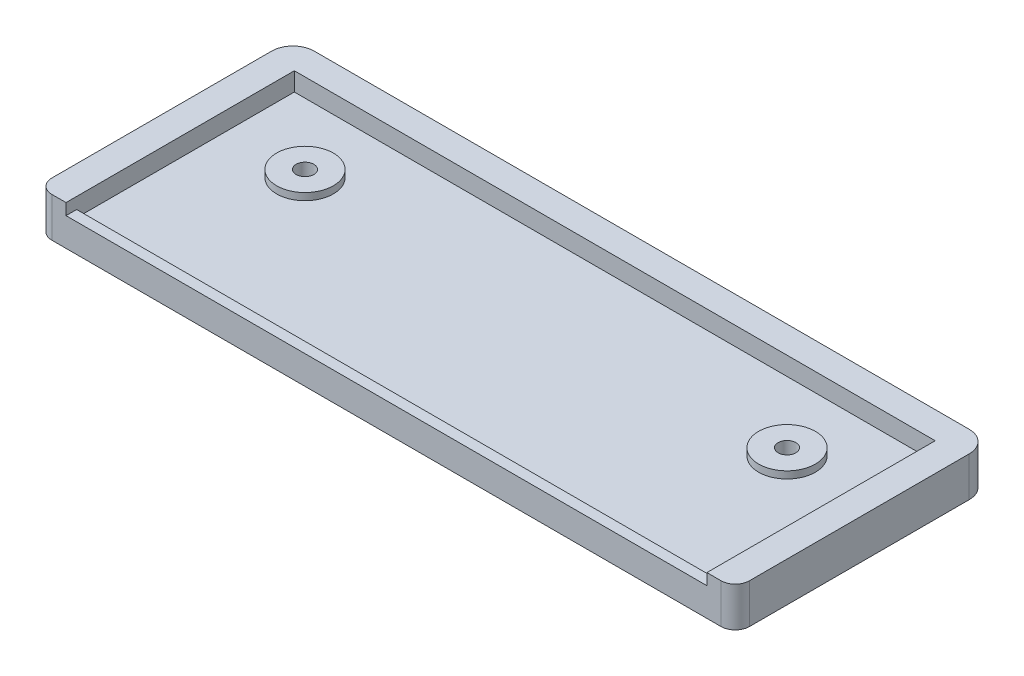
ISO-10303-21;
HEADER;
FILE_DESCRIPTION(('STEP AP214'),'2;1');
FILE_NAME('part.step','',(''),(''),'','','');
FILE_SCHEMA(('AUTOMOTIVE_DESIGN { 1 0 10303 214 1 1 1 1 }'));
ENDSEC;
DATA;
#1=APPLICATION_CONTEXT('core data for automotive mechanical design processes');
#2=APPLICATION_PROTOCOL_DEFINITION('international standard','automotive_design',2000,#1);
#3=PRODUCT_CONTEXT('',#1,'mechanical');
#4=PRODUCT('Part','Part','',(#3));
#5=PRODUCT_RELATED_PRODUCT_CATEGORY('part','',(#4));
#6=PRODUCT_DEFINITION_FORMATION('','',#4);
#7=PRODUCT_DEFINITION_CONTEXT('part definition',#1,'design');
#8=PRODUCT_DEFINITION('design','',#6,#7);
#9=PRODUCT_DEFINITION_SHAPE('','',#8);
#10=(LENGTH_UNIT() NAMED_UNIT(*) SI_UNIT(.MILLI.,.METRE.));
#11=(NAMED_UNIT(*) PLANE_ANGLE_UNIT() SI_UNIT($,.RADIAN.));
#12=(NAMED_UNIT(*) SI_UNIT($,.STERADIAN.) SOLID_ANGLE_UNIT());
#13=UNCERTAINTY_MEASURE_WITH_UNIT(LENGTH_MEASURE(1.E-05),#10,'distance_accuracy_value','');
#14=(GEOMETRIC_REPRESENTATION_CONTEXT(3) GLOBAL_UNCERTAINTY_ASSIGNED_CONTEXT((#13)) GLOBAL_UNIT_ASSIGNED_CONTEXT((#10,
#11,#12)) REPRESENTATION_CONTEXT('',''));
#15=CARTESIAN_POINT('',(0.,0.,0.));
#16=DIRECTION('',(0.,0.,1.));
#17=DIRECTION('',(1.,0.,0.));
#18=AXIS2_PLACEMENT_3D('',#15,#16,#17);
#19=CARTESIAN_POINT('',(0.,3.,0.));
#20=DIRECTION('',(0.,1.,0.));
#21=DIRECTION('',(0.,0.,1.));
#22=AXIS2_PLACEMENT_3D('',#19,#20,#21);
#23=PLANE('',#22);
#24=CARTESIAN_POINT('',(11.,3.,9.5));
#25=DIRECTION('',(0.,1.,0.));
#26=DIRECTION('',(0.,0.,1.));
#27=AXIS2_PLACEMENT_3D('',#24,#25,#26);
#28=CIRCLE('',#27,4.);
#29=CARTESIAN_POINT('',(11.,3.,13.5));
#30=VERTEX_POINT('',#29);
#31=EDGE_CURVE('E350',#30,#30,#28,.T.);
#32=ORIENTED_EDGE('',*,*,#31,.F.);
#33=EDGE_LOOP('',(#32));
#34=FACE_BOUND('',#33,.T.);
#35=CARTESIAN_POINT('',(78.98,3.,9.5));
#36=DIRECTION('',(0.,1.,0.));
#37=DIRECTION('',(0.,0.,1.));
#38=AXIS2_PLACEMENT_3D('',#35,#36,#37);
#39=CIRCLE('',#38,4.00000000000001);
#40=CARTESIAN_POINT('',(78.98,3.,13.5));
#41=VERTEX_POINT('',#40);
#42=EDGE_CURVE('E458',#41,#41,#39,.T.);
#43=ORIENTED_EDGE('',*,*,#42,.F.);
#44=EDGE_LOOP('',(#43));
#45=FACE_BOUND('',#44,.T.);
#46=DIRECTION('',(0.,0.,1.));
#47=VECTOR('',#46,1.);
#48=CARTESIAN_POINT('',(-0.199999999999996,3.,0.));
#49=LINE('',#48,#47);
#50=CARTESIAN_POINT('',(-0.199999999999996,3.,-0.199999999999999));
#51=VERTEX_POINT('',#50);
#52=CARTESIAN_POINT('',(-0.199999999999996,3.,30.5));
#53=VERTEX_POINT('',#52);
#54=EDGE_CURVE('E346',#51,#53,#49,.T.);
#55=ORIENTED_EDGE('',*,*,#54,.T.);
#56=DIRECTION('',(-1.,0.,0.));
#57=VECTOR('',#56,1.);
#58=CARTESIAN_POINT('',(-0.199999999999996,3.,30.5));
#59=LINE('',#58,#57);
#60=CARTESIAN_POINT('',(90.18,3.,30.5));
#61=VERTEX_POINT('',#60);
#62=EDGE_CURVE('E326',#61,#53,#59,.T.);
#63=ORIENTED_EDGE('',*,*,#62,.F.);
#64=DIRECTION('',(0.,0.,-1.));
#65=VECTOR('',#64,1.);
#66=CARTESIAN_POINT('',(90.18,3.,0.));
#67=LINE('',#66,#65);
#68=CARTESIAN_POINT('',(90.18,3.,-0.199999999999999));
#69=VERTEX_POINT('',#68);
#70=EDGE_CURVE('E463',#61,#69,#67,.T.);
#71=ORIENTED_EDGE('',*,*,#70,.T.);
#72=DIRECTION('',(-1.,0.,0.));
#73=VECTOR('',#72,1.);
#74=CARTESIAN_POINT('',(0.,3.,-0.199999999999999));
#75=LINE('',#74,#73);
#76=EDGE_CURVE('E469',#69,#51,#75,.T.);
#77=ORIENTED_EDGE('',*,*,#76,.T.);
#78=EDGE_LOOP('',(#55,#63,#71,#77));
#79=FACE_BOUND('',#78,.T.);
#80=ADVANCED_FACE('F207',(#34,#45,#79),#23,.T.);
#81=CARTESIAN_POINT('',(90.18,4.,0.));
#82=DIRECTION('',(-1.,0.,0.));
#83=DIRECTION('',(0.,0.,1.));
#84=AXIS2_PLACEMENT_3D('',#81,#82,#83);
#85=PLANE('',#84);
#86=ORIENTED_EDGE('',*,*,#70,.F.);
#87=DIRECTION('',(0.,-1.,0.));
#88=VECTOR('',#87,1.);
#89=CARTESIAN_POINT('',(90.18,4.,30.5));
#90=LINE('',#89,#88);
#91=CARTESIAN_POINT('',(90.18,4.,30.5));
#92=VERTEX_POINT('',#91);
#93=EDGE_CURVE('E480',#92,#61,#90,.T.);
#94=ORIENTED_EDGE('',*,*,#93,.F.);
#95=DIRECTION('',(0.,0.,-1.));
#96=VECTOR('',#95,1.);
#97=CARTESIAN_POINT('',(90.18,4.,32.));
#98=LINE('',#97,#96);
#99=CARTESIAN_POINT('',(90.18,4.,32.));
#100=VERTEX_POINT('',#99);
#101=EDGE_CURVE('E318',#100,#92,#98,.T.);
#102=ORIENTED_EDGE('',*,*,#101,.F.);
#103=DIRECTION('',(0.,-1.,0.));
#104=VECTOR('',#103,1.);
#105=CARTESIAN_POINT('',(90.18,4.,32.));
#106=LINE('',#105,#104);
#107=CARTESIAN_POINT('',(90.18,5.6,32.));
#108=VERTEX_POINT('',#107);
#109=EDGE_CURVE('E314',#108,#100,#106,.T.);
#110=ORIENTED_EDGE('',*,*,#109,.F.);
#111=DIRECTION('',(0.,0.,-1.));
#112=VECTOR('',#111,1.);
#113=CARTESIAN_POINT('',(90.18,5.6,30.));
#114=LINE('',#113,#112);
#115=CARTESIAN_POINT('',(90.18,5.6,-0.199999999999999));
#116=VERTEX_POINT('',#115);
#117=EDGE_CURVE('E484',#108,#116,#114,.T.);
#118=ORIENTED_EDGE('',*,*,#117,.T.);
#119=DIRECTION('',(0.,-1.,0.));
#120=VECTOR('',#119,1.);
#121=CARTESIAN_POINT('',(90.18,4.,-0.199999999999999));
#122=LINE('',#121,#120);
#123=EDGE_CURVE('E339',#116,#69,#122,.T.);
#124=ORIENTED_EDGE('',*,*,#123,.T.);
#125=EDGE_LOOP('',(#86,#94,#102,#110,#118,#124));
#126=FACE_BOUND('',#125,.T.);
#127=ADVANCED_FACE('F528',(#126),#85,.T.);
#128=CARTESIAN_POINT('',(-0.199999999999996,4.,0.));
#129=DIRECTION('',(1.,0.,0.));
#130=DIRECTION('',(0.,0.,-1.));
#131=AXIS2_PLACEMENT_3D('',#128,#129,#130);
#132=PLANE('',#131);
#133=DIRECTION('',(0.,0.,1.));
#134=VECTOR('',#133,1.);
#135=CARTESIAN_POINT('',(-0.199999999999996,4.,32.));
#136=LINE('',#135,#134);
#137=CARTESIAN_POINT('',(-0.199999999999996,4.,30.5));
#138=VERTEX_POINT('',#137);
#139=CARTESIAN_POINT('',(-0.199999999999996,4.,32.));
#140=VERTEX_POINT('',#139);
#141=EDGE_CURVE('E319',#138,#140,#136,.T.);
#142=ORIENTED_EDGE('',*,*,#141,.F.);
#143=DIRECTION('',(0.,-1.,0.));
#144=VECTOR('',#143,1.);
#145=CARTESIAN_POINT('',(-0.199999999999996,4.,30.5));
#146=LINE('',#145,#144);
#147=EDGE_CURVE('E223',#138,#53,#146,.T.);
#148=ORIENTED_EDGE('',*,*,#147,.T.);
#149=ORIENTED_EDGE('',*,*,#54,.F.);
#150=DIRECTION('',(0.,-1.,0.));
#151=VECTOR('',#150,1.);
#152=CARTESIAN_POINT('',(-0.199999999999996,4.,-0.199999999999999));
#153=LINE('',#152,#151);
#154=CARTESIAN_POINT('',(-0.199999999999996,5.6,-0.199999999999999));
#155=VERTEX_POINT('',#154);
#156=EDGE_CURVE('E333',#155,#51,#153,.T.);
#157=ORIENTED_EDGE('',*,*,#156,.F.);
#158=DIRECTION('',(0.,0.,1.));
#159=VECTOR('',#158,1.);
#160=CARTESIAN_POINT('',(-0.199999999999996,5.6,30.));
#161=LINE('',#160,#159);
#162=CARTESIAN_POINT('',(-0.199999999999996,5.6,32.));
#163=VERTEX_POINT('',#162);
#164=EDGE_CURVE('E331',#155,#163,#161,.T.);
#165=ORIENTED_EDGE('',*,*,#164,.T.);
#166=DIRECTION('',(0.,-1.,0.));
#167=VECTOR('',#166,1.);
#168=CARTESIAN_POINT('',(-0.199999999999996,4.,32.));
#169=LINE('',#168,#167);
#170=EDGE_CURVE('E311',#163,#140,#169,.T.);
#171=ORIENTED_EDGE('',*,*,#170,.T.);
#172=EDGE_LOOP('',(#142,#148,#149,#157,#165,#171));
#173=FACE_BOUND('',#172,.T.);
#174=ADVANCED_FACE('F329',(#173),#132,.T.);
#175=CARTESIAN_POINT('',(0.,3.,32.));
#176=DIRECTION('',(0.,0.,-1.));
#177=DIRECTION('',(-1.,0.,0.));
#178=AXIS2_PLACEMENT_3D('',#175,#176,#177);
#179=PLANE('',#178);
#180=DIRECTION('',(1.,0.,0.));
#181=VECTOR('',#180,1.);
#182=CARTESIAN_POINT('',(0.,0.,32.));
#183=LINE('',#182,#181);
#184=CARTESIAN_POINT('',(-2.19999999999998,0.,32.));
#185=VERTEX_POINT('',#184);
#186=CARTESIAN_POINT('',(92.18,0.,32.));
#187=VERTEX_POINT('',#186);
#188=EDGE_CURVE('E355',#185,#187,#183,.T.);
#189=ORIENTED_EDGE('',*,*,#188,.T.);
#190=DIRECTION('',(0.,-1.,0.));
#191=VECTOR('',#190,1.);
#192=CARTESIAN_POINT('',(92.18,3.,32.));
#193=LINE('',#192,#191);
#194=CARTESIAN_POINT('',(92.18,5.6,32.));
#195=VERTEX_POINT('',#194);
#196=EDGE_CURVE('E12',#195,#187,#193,.T.);
#197=ORIENTED_EDGE('',*,*,#196,.F.);
#198=DIRECTION('',(1.,0.,0.));
#199=VECTOR('',#198,1.);
#200=CARTESIAN_POINT('',(-2.2,5.6,32.));
#201=LINE('',#200,#199);
#202=EDGE_CURVE('E446',#108,#195,#201,.T.);
#203=ORIENTED_EDGE('',*,*,#202,.F.);
#204=ORIENTED_EDGE('',*,*,#109,.T.);
#205=DIRECTION('',(1.,0.,0.));
#206=VECTOR('',#205,1.);
#207=CARTESIAN_POINT('',(-0.199999999999996,4.,32.));
#208=LINE('',#207,#206);
#209=EDGE_CURVE('E308',#140,#100,#208,.T.);
#210=ORIENTED_EDGE('',*,*,#209,.F.);
#211=ORIENTED_EDGE('',*,*,#170,.F.);
#212=DIRECTION('',(1.,0.,0.));
#213=VECTOR('',#212,1.);
#214=CARTESIAN_POINT('',(-2.2,5.6,32.));
#215=LINE('',#214,#213);
#216=CARTESIAN_POINT('',(-2.2,5.6,32.));
#217=VERTEX_POINT('',#216);
#218=EDGE_CURVE('E498',#217,#163,#215,.T.);
#219=ORIENTED_EDGE('',*,*,#218,.F.);
#220=DIRECTION('',(0.,-1.,0.));
#221=VECTOR('',#220,1.);
#222=CARTESIAN_POINT('',(-2.19999999999998,3.,32.));
#223=LINE('',#222,#221);
#224=EDGE_CURVE('E231',#217,#185,#223,.T.);
#225=ORIENTED_EDGE('',*,*,#224,.T.);
#226=EDGE_LOOP('',(#189,#197,#203,#204,#210,#211,#219,#225));
#227=FACE_BOUND('',#226,.T.);
#228=ADVANCED_FACE('F209',(#227),#179,.F.);
#229=CARTESIAN_POINT('',(92.18,3.,30.));
#230=DIRECTION('',(0.,-1.,0.));
#231=DIRECTION('',(0.,0.,-1.));
#232=AXIS2_PLACEMENT_3D('',#229,#230,#231);
#233=CYLINDRICAL_SURFACE('',#232,2.);
#234=CARTESIAN_POINT('',(92.18,0.,30.));
#235=DIRECTION('',(0.,1.,0.));
#236=DIRECTION('',(0.,0.,1.));
#237=AXIS2_PLACEMENT_3D('',#234,#235,#236);
#238=CIRCLE('',#237,2.);
#239=CARTESIAN_POINT('',(94.18,0.,30.));
#240=VERTEX_POINT('',#239);
#241=EDGE_CURVE('E361',#240,#187,#238,.F.);
#242=ORIENTED_EDGE('',*,*,#241,.F.);
#243=DIRECTION('',(0.,-1.,0.));
#244=VECTOR('',#243,1.);
#245=CARTESIAN_POINT('',(94.18,3.,30.));
#246=LINE('',#245,#244);
#247=CARTESIAN_POINT('',(94.18,5.6,30.));
#248=VERTEX_POINT('',#247);
#249=EDGE_CURVE('E216',#248,#240,#246,.T.);
#250=ORIENTED_EDGE('',*,*,#249,.F.);
#251=CARTESIAN_POINT('',(92.18,5.6,30.));
#252=DIRECTION('',(0.,1.,0.));
#253=DIRECTION('',(0.,0.,1.));
#254=AXIS2_PLACEMENT_3D('',#251,#252,#253);
#255=CIRCLE('',#254,2.);
#256=EDGE_CURVE('E441',#195,#248,#255,.T.);
#257=ORIENTED_EDGE('',*,*,#256,.F.);
#258=ORIENTED_EDGE('',*,*,#196,.T.);
#259=EDGE_LOOP('',(#242,#250,#257,#258));
#260=FACE_BOUND('',#259,.T.);
#261=ADVANCED_FACE('F424',(#260),#233,.T.);
#262=CARTESIAN_POINT('',(94.18,3.,0.));
#263=DIRECTION('',(1.,0.,0.));
#264=DIRECTION('',(0.,0.,-1.));
#265=AXIS2_PLACEMENT_3D('',#262,#263,#264);
#266=PLANE('',#265);
#267=DIRECTION('',(0.,0.,1.));
#268=VECTOR('',#267,1.);
#269=CARTESIAN_POINT('',(94.18,0.,0.));
#270=LINE('',#269,#268);
#271=CARTESIAN_POINT('',(94.18,0.,-0.999999999999979));
#272=VERTEX_POINT('',#271);
#273=EDGE_CURVE('E365',#272,#240,#270,.T.);
#274=ORIENTED_EDGE('',*,*,#273,.F.);
#275=DIRECTION('',(0.,-1.,0.));
#276=VECTOR('',#275,1.);
#277=CARTESIAN_POINT('',(94.18,3.,-0.999999999999979));
#278=LINE('',#277,#276);
#279=CARTESIAN_POINT('',(94.18,5.6,-0.999999999999977));
#280=VERTEX_POINT('',#279);
#281=EDGE_CURVE('E411',#280,#272,#278,.T.);
#282=ORIENTED_EDGE('',*,*,#281,.F.);
#283=DIRECTION('',(0.,0.,-1.));
#284=VECTOR('',#283,1.);
#285=CARTESIAN_POINT('',(94.18,5.6,30.));
#286=LINE('',#285,#284);
#287=EDGE_CURVE('E420',#248,#280,#286,.T.);
#288=ORIENTED_EDGE('',*,*,#287,.F.);
#289=ORIENTED_EDGE('',*,*,#249,.T.);
#290=EDGE_LOOP('',(#274,#282,#288,#289));
#291=FACE_BOUND('',#290,.T.);
#292=ADVANCED_FACE('F418',(#291),#266,.T.);
#293=CARTESIAN_POINT('',(91.18,3.,-1.));
#294=DIRECTION('',(0.,-1.,0.));
#295=DIRECTION('',(0.,0.,-1.));
#296=AXIS2_PLACEMENT_3D('',#293,#294,#295);
#297=CYLINDRICAL_SURFACE('',#296,3.);
#298=CARTESIAN_POINT('',(91.18,0.,-1.));
#299=DIRECTION('',(0.,1.,0.));
#300=DIRECTION('',(0.,0.,1.));
#301=AXIS2_PLACEMENT_3D('',#298,#299,#300);
#302=CIRCLE('',#301,3.);
#303=CARTESIAN_POINT('',(91.18,0.,-4.));
#304=VERTEX_POINT('',#303);
#305=EDGE_CURVE('E369',#304,#272,#302,.F.);
#306=ORIENTED_EDGE('',*,*,#305,.F.);
#307=DIRECTION('',(0.,-1.,0.));
#308=VECTOR('',#307,1.);
#309=CARTESIAN_POINT('',(91.18,3.,-4.));
#310=LINE('',#309,#308);
#311=CARTESIAN_POINT('',(91.18,5.6,-4.));
#312=VERTEX_POINT('',#311);
#313=EDGE_CURVE('E408',#312,#304,#310,.T.);
#314=ORIENTED_EDGE('',*,*,#313,.F.);
#315=CARTESIAN_POINT('',(91.18,5.6,-1.));
#316=DIRECTION('',(0.,1.,0.));
#317=DIRECTION('',(0.,0.,1.));
#318=AXIS2_PLACEMENT_3D('',#315,#316,#317);
#319=CIRCLE('',#318,3.);
#320=EDGE_CURVE('E434',#280,#312,#319,.T.);
#321=ORIENTED_EDGE('',*,*,#320,.F.);
#322=ORIENTED_EDGE('',*,*,#281,.T.);
#323=EDGE_LOOP('',(#306,#314,#321,#322));
#324=FACE_BOUND('',#323,.T.);
#325=ADVANCED_FACE('F431',(#324),#297,.T.);
#326=CARTESIAN_POINT('',(0.,3.,-4.));
#327=DIRECTION('',(0.,0.,-1.));
#328=DIRECTION('',(-1.,0.,0.));
#329=AXIS2_PLACEMENT_3D('',#326,#327,#328);
#330=PLANE('',#329);
#331=DIRECTION('',(1.,0.,0.));
#332=VECTOR('',#331,1.);
#333=CARTESIAN_POINT('',(0.,0.,-4.));
#334=LINE('',#333,#332);
#335=CARTESIAN_POINT('',(-1.19999999999998,0.,-4.));
#336=VERTEX_POINT('',#335);
#337=EDGE_CURVE('E373',#336,#304,#334,.T.);
#338=ORIENTED_EDGE('',*,*,#337,.F.);
#339=DIRECTION('',(0.,-1.,0.));
#340=VECTOR('',#339,1.);
#341=CARTESIAN_POINT('',(-1.19999999999998,3.,-4.));
#342=LINE('',#341,#340);
#343=CARTESIAN_POINT('',(-1.19999999999998,5.6,-4.));
#344=VERTEX_POINT('',#343);
#345=EDGE_CURVE('E405',#344,#336,#342,.T.);
#346=ORIENTED_EDGE('',*,*,#345,.F.);
#347=DIRECTION('',(-1.,0.,0.));
#348=VECTOR('',#347,1.);
#349=CARTESIAN_POINT('',(-2.2,5.6,-4.));
#350=LINE('',#349,#348);
#351=EDGE_CURVE('E448',#312,#344,#350,.T.);
#352=ORIENTED_EDGE('',*,*,#351,.F.);
#353=ORIENTED_EDGE('',*,*,#313,.T.);
#354=EDGE_LOOP('',(#338,#346,#352,#353));
#355=FACE_BOUND('',#354,.T.);
#356=ADVANCED_FACE('F575',(#355),#330,.T.);
#357=CARTESIAN_POINT('',(-1.2,3.,-1.));
#358=DIRECTION('',(0.,-1.,0.));
#359=DIRECTION('',(0.,0.,-1.));
#360=AXIS2_PLACEMENT_3D('',#357,#358,#359);
#361=CYLINDRICAL_SURFACE('',#360,3.);
#362=CARTESIAN_POINT('',(-1.2,0.,-1.));
#363=DIRECTION('',(0.,1.,0.));
#364=DIRECTION('',(0.,0.,1.));
#365=AXIS2_PLACEMENT_3D('',#362,#363,#364);
#366=CIRCLE('',#365,3.);
#367=CARTESIAN_POINT('',(-4.2,0.,-0.999999999999982));
#368=VERTEX_POINT('',#367);
#369=EDGE_CURVE('E377',#368,#336,#366,.F.);
#370=ORIENTED_EDGE('',*,*,#369,.F.);
#371=DIRECTION('',(0.,-1.,0.));
#372=VECTOR('',#371,1.);
#373=CARTESIAN_POINT('',(-4.2,3.,-0.999999999999982));
#374=LINE('',#373,#372);
#375=CARTESIAN_POINT('',(-4.2,5.6,-0.999999999999983));
#376=VERTEX_POINT('',#375);
#377=EDGE_CURVE('E402',#376,#368,#374,.T.);
#378=ORIENTED_EDGE('',*,*,#377,.F.);
#379=CARTESIAN_POINT('',(-1.2,5.6,-1.));
#380=DIRECTION('',(0.,1.,0.));
#381=DIRECTION('',(0.,0.,1.));
#382=AXIS2_PLACEMENT_3D('',#379,#380,#381);
#383=CIRCLE('',#382,3.);
#384=EDGE_CURVE('E509',#344,#376,#383,.T.);
#385=ORIENTED_EDGE('',*,*,#384,.F.);
#386=ORIENTED_EDGE('',*,*,#345,.T.);
#387=EDGE_LOOP('',(#370,#378,#385,#386));
#388=FACE_BOUND('',#387,.T.);
#389=ADVANCED_FACE('F518',(#388),#361,.T.);
#390=CARTESIAN_POINT('',(-4.2,3.,0.));
#391=DIRECTION('',(-1.,0.,0.));
#392=DIRECTION('',(0.,0.,1.));
#393=AXIS2_PLACEMENT_3D('',#390,#391,#392);
#394=PLANE('',#393);
#395=DIRECTION('',(0.,0.,-1.));
#396=VECTOR('',#395,1.);
#397=CARTESIAN_POINT('',(-4.2,0.,0.));
#398=LINE('',#397,#396);
#399=CARTESIAN_POINT('',(-4.2,0.,30.));
#400=VERTEX_POINT('',#399);
#401=EDGE_CURVE('E381',#400,#368,#398,.T.);
#402=ORIENTED_EDGE('',*,*,#401,.F.);
#403=DIRECTION('',(0.,-1.,0.));
#404=VECTOR('',#403,1.);
#405=CARTESIAN_POINT('',(-4.2,3.,30.));
#406=LINE('',#405,#404);
#407=CARTESIAN_POINT('',(-4.2,5.6,30.));
#408=VERTEX_POINT('',#407);
#409=EDGE_CURVE('E399',#408,#400,#406,.T.);
#410=ORIENTED_EDGE('',*,*,#409,.F.);
#411=DIRECTION('',(0.,0.,1.));
#412=VECTOR('',#411,1.);
#413=CARTESIAN_POINT('',(-4.2,5.6,30.));
#414=LINE('',#413,#412);
#415=EDGE_CURVE('E505',#376,#408,#414,.T.);
#416=ORIENTED_EDGE('',*,*,#415,.F.);
#417=ORIENTED_EDGE('',*,*,#377,.T.);
#418=EDGE_LOOP('',(#402,#410,#416,#417));
#419=FACE_BOUND('',#418,.T.);
#420=ADVANCED_FACE('F521',(#419),#394,.T.);
#421=CARTESIAN_POINT('',(11.,3.,9.5));
#422=DIRECTION('',(0.,-1.,0.));
#423=DIRECTION('',(0.,0.,-1.));
#424=AXIS2_PLACEMENT_3D('',#421,#422,#423);
#425=CYLINDRICAL_SURFACE('',#424,1.25);
#426=CARTESIAN_POINT('',(11.,0.,9.5));
#427=DIRECTION('',(0.,1.,0.));
#428=DIRECTION('',(0.,0.,1.));
#429=AXIS2_PLACEMENT_3D('',#426,#427,#428);
#430=CIRCLE('',#429,1.25);
#431=CARTESIAN_POINT('',(11.,0.,10.75));
#432=VERTEX_POINT('',#431);
#433=EDGE_CURVE('E389',#432,#432,#430,.T.);
#434=ORIENTED_EDGE('',*,*,#433,.F.);
#435=EDGE_LOOP('',(#434));
#436=FACE_BOUND('',#435,.T.);
#437=CARTESIAN_POINT('',(11.,4.,9.5));
#438=DIRECTION('',(0.,1.,0.));
#439=DIRECTION('',(0.,0.,1.));
#440=AXIS2_PLACEMENT_3D('',#437,#438,#439);
#441=CIRCLE('',#440,1.25);
#442=CARTESIAN_POINT('',(11.,4.,10.75));
#443=VERTEX_POINT('',#442);
#444=EDGE_CURVE('E337',#443,#443,#441,.T.);
#445=ORIENTED_EDGE('',*,*,#444,.T.);
#446=EDGE_LOOP('',(#445));
#447=FACE_BOUND('',#446,.T.);
#448=ADVANCED_FACE('F565',(#436,#447),#425,.F.);
#449=CARTESIAN_POINT('',(-2.2,3.,30.));
#450=DIRECTION('',(0.,-1.,0.));
#451=DIRECTION('',(0.,0.,-1.));
#452=AXIS2_PLACEMENT_3D('',#449,#450,#451);
#453=CYLINDRICAL_SURFACE('',#452,2.);
#454=CARTESIAN_POINT('',(-2.2,0.,30.));
#455=DIRECTION('',(0.,1.,0.));
#456=DIRECTION('',(0.,0.,1.));
#457=AXIS2_PLACEMENT_3D('',#454,#455,#456);
#458=CIRCLE('',#457,2.);
#459=EDGE_CURVE('E385',#185,#400,#458,.F.);
#460=ORIENTED_EDGE('',*,*,#459,.F.);
#461=ORIENTED_EDGE('',*,*,#224,.F.);
#462=CARTESIAN_POINT('',(-2.2,5.6,30.));
#463=DIRECTION('',(0.,1.,0.));
#464=DIRECTION('',(0.,0.,1.));
#465=AXIS2_PLACEMENT_3D('',#462,#463,#464);
#466=CIRCLE('',#465,2.);
#467=EDGE_CURVE('E501',#408,#217,#466,.T.);
#468=ORIENTED_EDGE('',*,*,#467,.F.);
#469=ORIENTED_EDGE('',*,*,#409,.T.);
#470=EDGE_LOOP('',(#460,#461,#468,#469));
#471=FACE_BOUND('',#470,.T.);
#472=ADVANCED_FACE('F525',(#471),#453,.T.);
#473=CARTESIAN_POINT('',(78.98,3.,9.5));
#474=DIRECTION('',(0.,-1.,0.));
#475=DIRECTION('',(0.,0.,-1.));
#476=AXIS2_PLACEMENT_3D('',#473,#474,#475);
#477=CYLINDRICAL_SURFACE('',#476,1.25);
#478=CARTESIAN_POINT('',(78.98,0.,9.5));
#479=DIRECTION('',(0.,1.,0.));
#480=DIRECTION('',(0.,0.,1.));
#481=AXIS2_PLACEMENT_3D('',#478,#479,#480);
#482=CIRCLE('',#481,1.25);
#483=CARTESIAN_POINT('',(78.98,0.,10.75));
#484=VERTEX_POINT('',#483);
#485=EDGE_CURVE('E393',#484,#484,#482,.T.);
#486=ORIENTED_EDGE('',*,*,#485,.F.);
#487=EDGE_LOOP('',(#486));
#488=FACE_BOUND('',#487,.T.);
#489=CARTESIAN_POINT('',(78.98,4.,9.5));
#490=DIRECTION('',(0.,1.,0.));
#491=DIRECTION('',(0.,0.,1.));
#492=AXIS2_PLACEMENT_3D('',#489,#490,#491);
#493=CIRCLE('',#492,1.25);
#494=CARTESIAN_POINT('',(78.98,4.,10.75));
#495=VERTEX_POINT('',#494);
#496=EDGE_CURVE('E454',#495,#495,#493,.T.);
#497=ORIENTED_EDGE('',*,*,#496,.T.);
#498=EDGE_LOOP('',(#497));
#499=FACE_BOUND('',#498,.T.);
#500=ADVANCED_FACE('F561',(#488,#499),#477,.F.);
#501=CARTESIAN_POINT('',(0.,0.,0.));
#502=DIRECTION('',(0.,1.,0.));
#503=DIRECTION('',(0.,0.,1.));
#504=AXIS2_PLACEMENT_3D('',#501,#502,#503);
#505=PLANE('',#504);
#506=ORIENTED_EDGE('',*,*,#188,.F.);
#507=ORIENTED_EDGE('',*,*,#459,.T.);
#508=ORIENTED_EDGE('',*,*,#401,.T.);
#509=ORIENTED_EDGE('',*,*,#369,.T.);
#510=ORIENTED_EDGE('',*,*,#337,.T.);
#511=ORIENTED_EDGE('',*,*,#305,.T.);
#512=ORIENTED_EDGE('',*,*,#273,.T.);
#513=ORIENTED_EDGE('',*,*,#241,.T.);
#514=EDGE_LOOP('',(#506,#507,#508,#509,#510,#511,#512,#513));
#515=FACE_BOUND('',#514,.T.);
#516=ORIENTED_EDGE('',*,*,#433,.T.);
#517=EDGE_LOOP('',(#516));
#518=FACE_BOUND('',#517,.T.);
#519=ORIENTED_EDGE('',*,*,#485,.T.);
#520=EDGE_LOOP('',(#519));
#521=FACE_BOUND('',#520,.T.);
#522=ADVANCED_FACE('F426',(#515,#518,#521),#505,.F.);
#523=CARTESIAN_POINT('',(11.,4.,9.5));
#524=DIRECTION('',(0.,1.,0.));
#525=DIRECTION('',(0.,0.,1.));
#526=AXIS2_PLACEMENT_3D('',#523,#524,#525);
#527=PLANE('',#526);
#528=CARTESIAN_POINT('',(11.,4.,9.5));
#529=DIRECTION('',(0.,1.,0.));
#530=DIRECTION('',(0.,0.,1.));
#531=AXIS2_PLACEMENT_3D('',#528,#529,#530);
#532=CIRCLE('',#531,4.);
#533=CARTESIAN_POINT('',(11.,4.,13.5));
#534=VERTEX_POINT('',#533);
#535=EDGE_CURVE('E351',#534,#534,#532,.T.);
#536=ORIENTED_EDGE('',*,*,#535,.T.);
#537=EDGE_LOOP('',(#536));
#538=FACE_BOUND('',#537,.T.);
#539=ORIENTED_EDGE('',*,*,#444,.F.);
#540=EDGE_LOOP('',(#539));
#541=FACE_BOUND('',#540,.T.);
#542=ADVANCED_FACE('F560',(#538,#541),#527,.T.);
#543=CARTESIAN_POINT('',(11.,4.,9.5));
#544=DIRECTION('',(0.,-1.,0.));
#545=DIRECTION('',(0.,0.,-1.));
#546=AXIS2_PLACEMENT_3D('',#543,#544,#545);
#547=CYLINDRICAL_SURFACE('',#546,4.);
#548=ORIENTED_EDGE('',*,*,#535,.F.);
#549=EDGE_LOOP('',(#548));
#550=FACE_BOUND('',#549,.T.);
#551=ORIENTED_EDGE('',*,*,#31,.T.);
#552=EDGE_LOOP('',(#551));
#553=FACE_BOUND('',#552,.T.);
#554=ADVANCED_FACE('F556',(#550,#553),#547,.T.);
#555=CARTESIAN_POINT('',(0.,4.,-0.199999999999999));
#556=DIRECTION('',(0.,0.,1.));
#557=DIRECTION('',(1.,0.,0.));
#558=AXIS2_PLACEMENT_3D('',#555,#556,#557);
#559=PLANE('',#558);
#560=ORIENTED_EDGE('',*,*,#76,.F.);
#561=ORIENTED_EDGE('',*,*,#123,.F.);
#562=DIRECTION('',(-1.,0.,0.));
#563=VECTOR('',#562,1.);
#564=CARTESIAN_POINT('',(-2.2,5.6,-0.199999999999999));
#565=LINE('',#564,#563);
#566=EDGE_CURVE('E492',#116,#155,#565,.T.);
#567=ORIENTED_EDGE('',*,*,#566,.T.);
#568=ORIENTED_EDGE('',*,*,#156,.T.);
#569=EDGE_LOOP('',(#560,#561,#567,#568));
#570=FACE_BOUND('',#569,.T.);
#571=ADVANCED_FACE('F594',(#570),#559,.T.);
#572=CARTESIAN_POINT('',(78.98,4.,9.5));
#573=DIRECTION('',(0.,1.,0.));
#574=DIRECTION('',(0.,0.,1.));
#575=AXIS2_PLACEMENT_3D('',#572,#573,#574);
#576=PLANE('',#575);
#577=CARTESIAN_POINT('',(78.98,4.,9.5));
#578=DIRECTION('',(0.,1.,0.));
#579=DIRECTION('',(0.,0.,1.));
#580=AXIS2_PLACEMENT_3D('',#577,#578,#579);
#581=CIRCLE('',#580,4.00000000000001);
#582=CARTESIAN_POINT('',(78.98,4.,13.5));
#583=VERTEX_POINT('',#582);
#584=EDGE_CURVE('E459',#583,#583,#581,.T.);
#585=ORIENTED_EDGE('',*,*,#584,.T.);
#586=EDGE_LOOP('',(#585));
#587=FACE_BOUND('',#586,.T.);
#588=ORIENTED_EDGE('',*,*,#496,.F.);
#589=EDGE_LOOP('',(#588));
#590=FACE_BOUND('',#589,.T.);
#591=ADVANCED_FACE('F596',(#587,#590),#576,.T.);
#592=CARTESIAN_POINT('',(78.98,4.,9.5));
#593=DIRECTION('',(0.,-1.,0.));
#594=DIRECTION('',(0.,0.,-1.));
#595=AXIS2_PLACEMENT_3D('',#592,#593,#594);
#596=CYLINDRICAL_SURFACE('',#595,4.00000000000001);
#597=ORIENTED_EDGE('',*,*,#584,.F.);
#598=EDGE_LOOP('',(#597));
#599=FACE_BOUND('',#598,.T.);
#600=ORIENTED_EDGE('',*,*,#42,.T.);
#601=EDGE_LOOP('',(#600));
#602=FACE_BOUND('',#601,.T.);
#603=ADVANCED_FACE('F542',(#599,#602),#596,.T.);
#604=CARTESIAN_POINT('',(-2.2,5.6,30.));
#605=DIRECTION('',(0.,1.,0.));
#606=DIRECTION('',(0.,0.,1.));
#607=AXIS2_PLACEMENT_3D('',#604,#605,#606);
#608=PLANE('',#607);
#609=ORIENTED_EDGE('',*,*,#117,.F.);
#610=ORIENTED_EDGE('',*,*,#202,.T.);
#611=ORIENTED_EDGE('',*,*,#256,.T.);
#612=ORIENTED_EDGE('',*,*,#287,.T.);
#613=ORIENTED_EDGE('',*,*,#320,.T.);
#614=ORIENTED_EDGE('',*,*,#351,.T.);
#615=ORIENTED_EDGE('',*,*,#384,.T.);
#616=ORIENTED_EDGE('',*,*,#415,.T.);
#617=ORIENTED_EDGE('',*,*,#467,.T.);
#618=ORIENTED_EDGE('',*,*,#218,.T.);
#619=ORIENTED_EDGE('',*,*,#164,.F.);
#620=ORIENTED_EDGE('',*,*,#566,.F.);
#621=EDGE_LOOP('',(#609,#610,#611,#612,#613,#614,#615,#616,#617,#618,#619,#620));
#622=FACE_BOUND('',#621,.T.);
#623=ADVANCED_FACE('F437',(#622),#608,.T.);
#624=CARTESIAN_POINT('',(-0.199999999999996,4.,30.5));
#625=DIRECTION('',(0.,0.,1.));
#626=DIRECTION('',(1.,0.,0.));
#627=AXIS2_PLACEMENT_3D('',#624,#625,#626);
#628=PLANE('',#627);
#629=ORIENTED_EDGE('',*,*,#62,.T.);
#630=ORIENTED_EDGE('',*,*,#147,.F.);
#631=DIRECTION('',(-1.,0.,0.));
#632=VECTOR('',#631,1.);
#633=CARTESIAN_POINT('',(-0.199999999999996,4.,30.5));
#634=LINE('',#633,#632);
#635=EDGE_CURVE('E323',#92,#138,#634,.T.);
#636=ORIENTED_EDGE('',*,*,#635,.F.);
#637=ORIENTED_EDGE('',*,*,#93,.T.);
#638=EDGE_LOOP('',(#629,#630,#636,#637));
#639=FACE_BOUND('',#638,.T.);
#640=ADVANCED_FACE('F533',(#639),#628,.F.);
#641=CARTESIAN_POINT('',(0.,4.,0.));
#642=DIRECTION('',(0.,-1.,0.));
#643=DIRECTION('',(0.,0.,-1.));
#644=AXIS2_PLACEMENT_3D('',#641,#642,#643);
#645=PLANE('',#644);
#646=ORIENTED_EDGE('',*,*,#141,.T.);
#647=ORIENTED_EDGE('',*,*,#209,.T.);
#648=ORIENTED_EDGE('',*,*,#101,.T.);
#649=ORIENTED_EDGE('',*,*,#635,.T.);
#650=EDGE_LOOP('',(#646,#647,#648,#649));
#651=FACE_BOUND('',#650,.T.);
#652=ADVANCED_FACE('F322',(#651),#645,.F.);
#653=CLOSED_SHELL('',(#80,#127,#174,#228,#261,#292,#325,#356,#389,#420,#448,#472,#500,#522,#542,
#554,#571,#591,#603,#623,#640,#652));
#654=MANIFOLD_SOLID_BREP('B2',#653);
#655=ADVANCED_BREP_SHAPE_REPRESENTATION('',(#18,#654),#14);
#656=SHAPE_DEFINITION_REPRESENTATION(#9,#655);
ENDSEC;
END-ISO-10303-21;
